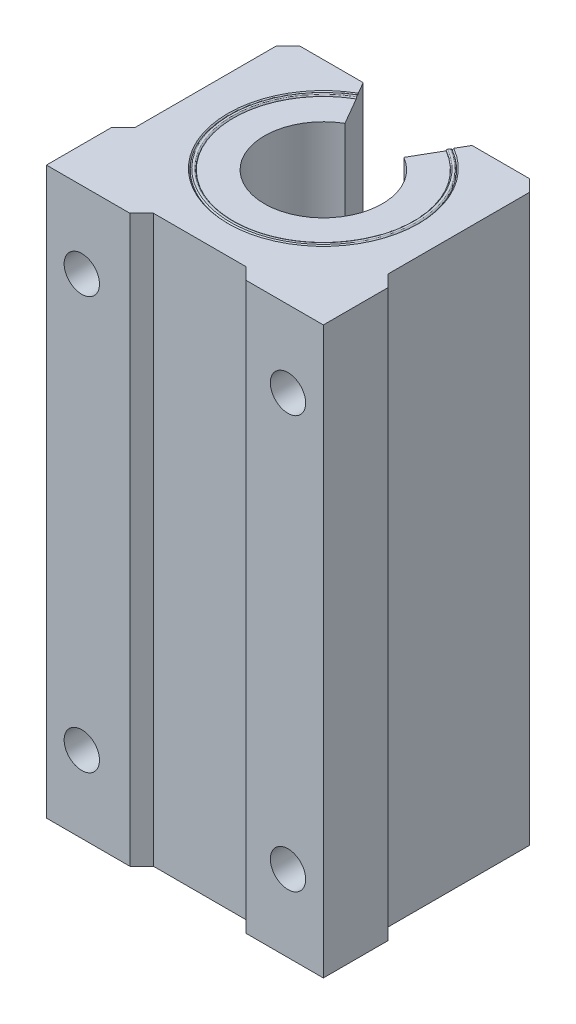
ISO-10303-21;
HEADER;
FILE_DESCRIPTION(('STEP AP214'),'2;1');
FILE_NAME('part.step','',(''),(''),'','','');
FILE_SCHEMA(('AUTOMOTIVE_DESIGN { 1 0 10303 214 1 1 1 1 }'));
ENDSEC;
DATA;
#1=APPLICATION_CONTEXT('core data for automotive mechanical design processes');
#2=APPLICATION_PROTOCOL_DEFINITION('international standard','automotive_design',2000,#1);
#3=PRODUCT_CONTEXT('',#1,'mechanical');
#4=PRODUCT('Part','Part','',(#3));
#5=PRODUCT_RELATED_PRODUCT_CATEGORY('part','',(#4));
#6=PRODUCT_DEFINITION_FORMATION('','',#4);
#7=PRODUCT_DEFINITION_CONTEXT('part definition',#1,'design');
#8=PRODUCT_DEFINITION('design','',#6,#7);
#9=PRODUCT_DEFINITION_SHAPE('','',#8);
#10=(LENGTH_UNIT() NAMED_UNIT(*) SI_UNIT(.MILLI.,.METRE.));
#11=(NAMED_UNIT(*) PLANE_ANGLE_UNIT() SI_UNIT($,.RADIAN.));
#12=(NAMED_UNIT(*) SI_UNIT($,.STERADIAN.) SOLID_ANGLE_UNIT());
#13=UNCERTAINTY_MEASURE_WITH_UNIT(LENGTH_MEASURE(1.E-05),#10,'distance_accuracy_value','');
#14=(GEOMETRIC_REPRESENTATION_CONTEXT(3) GLOBAL_UNCERTAINTY_ASSIGNED_CONTEXT((#13)) GLOBAL_UNIT_ASSIGNED_CONTEXT((#10,
#11,#12)) REPRESENTATION_CONTEXT('',''));
#15=CARTESIAN_POINT('',(0.,0.,0.));
#16=DIRECTION('',(0.,0.,1.));
#17=DIRECTION('',(1.,0.,0.));
#18=AXIS2_PLACEMENT_3D('',#15,#16,#17);
#19=CARTESIAN_POINT('',(0.,48.,0.));
#20=DIRECTION('',(0.,1.,0.));
#21=DIRECTION('',(0.,0.,1.));
#22=AXIS2_PLACEMENT_3D('',#19,#20,#21);
#23=PLANE('',#22);
#24=CARTESIAN_POINT('',(0.,48.,0.));
#25=DIRECTION('',(0.,1.,0.));
#26=DIRECTION('',(0.,0.,1.));
#27=AXIS2_PLACEMENT_3D('',#24,#25,#26);
#28=CIRCLE('',#27,15.45);
#29=CARTESIAN_POINT('',(-7.72500000000002,48.,-13.3800924884696));
#30=VERTEX_POINT('',#29);
#31=CARTESIAN_POINT('',(7.72499999999999,48.,-13.3800924884696));
#32=VERTEX_POINT('',#31);
#33=EDGE_CURVE('E221',#30,#32,#28,.T.);
#34=ORIENTED_EDGE('',*,*,#33,.F.);
#35=DIRECTION('',(-0.499999999999995,0.,-0.866025403784441));
#36=VECTOR('',#35,1.);
#37=CARTESIAN_POINT('',(-9.23760430703402,48.,-16.));
#38=LINE('',#37,#36);
#39=CARTESIAN_POINT('',(-7.89938053086696,48.,-13.6821284277819));
#40=VERTEX_POINT('',#39);
#41=EDGE_CURVE('E254',#30,#40,#38,.T.);
#42=ORIENTED_EDGE('',*,*,#41,.T.);
#43=CARTESIAN_POINT('',(0.,48.,0.));
#44=DIRECTION('',(0.,-1.,0.));
#45=DIRECTION('',(0.,0.,-1.));
#46=AXIS2_PLACEMENT_3D('',#43,#44,#45);
#47=CIRCLE('',#46,15.7987610617339);
#48=CARTESIAN_POINT('',(7.89938053086693,48.,-13.682128427782));
#49=VERTEX_POINT('',#48);
#50=EDGE_CURVE('E244',#40,#49,#47,.F.);
#51=ORIENTED_EDGE('',*,*,#50,.T.);
#52=DIRECTION('',(-0.500000000000007,0.,0.866025403784435));
#53=VECTOR('',#52,1.);
#54=CARTESIAN_POINT('',(9.23760430703402,48.,-16.));
#55=LINE('',#54,#53);
#56=EDGE_CURVE('E237',#49,#32,#55,.T.);
#57=ORIENTED_EDGE('',*,*,#56,.T.);
#58=EDGE_LOOP('',(#34,#42,#51,#57));
#59=FACE_BOUND('',#58,.T.);
#60=ADVANCED_FACE('F36',(#59),#23,.T.);
#61=CARTESIAN_POINT('',(0.,-48.,0.));
#62=DIRECTION('',(0.,1.,0.));
#63=DIRECTION('',(0.,0.,1.));
#64=AXIS2_PLACEMENT_3D('',#61,#62,#63);
#65=PLANE('',#64);
#66=CARTESIAN_POINT('',(0.,-48.,0.));
#67=DIRECTION('',(0.,1.,0.));
#68=DIRECTION('',(0.,0.,1.));
#69=AXIS2_PLACEMENT_3D('',#66,#67,#68);
#70=CIRCLE('',#69,15.45);
#71=CARTESIAN_POINT('',(-7.72500000000002,-48.,-13.3800924884696));
#72=VERTEX_POINT('',#71);
#73=CARTESIAN_POINT('',(7.72499999999999,-48.,-13.3800924884696));
#74=VERTEX_POINT('',#73);
#75=EDGE_CURVE('E399',#72,#74,#70,.T.);
#76=ORIENTED_EDGE('',*,*,#75,.T.);
#77=DIRECTION('',(-0.500000000000007,0.,0.866025403784435));
#78=VECTOR('',#77,1.);
#79=CARTESIAN_POINT('',(9.23760430703402,-48.,-16.));
#80=LINE('',#79,#78);
#81=CARTESIAN_POINT('',(7.89938053086693,-48.,-13.682128427782));
#82=VERTEX_POINT('',#81);
#83=EDGE_CURVE('E284',#82,#74,#80,.T.);
#84=ORIENTED_EDGE('',*,*,#83,.F.);
#85=CARTESIAN_POINT('',(0.,-48.,0.));
#86=DIRECTION('',(0.,1.,0.));
#87=DIRECTION('',(0.,0.,1.));
#88=AXIS2_PLACEMENT_3D('',#85,#86,#87);
#89=CIRCLE('',#88,15.7987610617339);
#90=CARTESIAN_POINT('',(-7.89938053086696,-48.,-13.6821284277819));
#91=VERTEX_POINT('',#90);
#92=EDGE_CURVE('E371',#82,#91,#89,.F.);
#93=ORIENTED_EDGE('',*,*,#92,.T.);
#94=DIRECTION('',(-0.499999999999995,0.,-0.866025403784441));
#95=VECTOR('',#94,1.);
#96=CARTESIAN_POINT('',(-9.23760430703402,-48.,-16.));
#97=LINE('',#96,#95);
#98=EDGE_CURVE('E289',#72,#91,#97,.T.);
#99=ORIENTED_EDGE('',*,*,#98,.F.);
#100=EDGE_LOOP('',(#76,#84,#93,#99));
#101=FACE_BOUND('',#100,.T.);
#102=ADVANCED_FACE('F540',(#101),#65,.F.);
#103=CARTESIAN_POINT('',(-7.83333333333334,48.,21.));
#104=DIRECTION('',(0.,0.,-1.));
#105=DIRECTION('',(-1.,0.,0.));
#106=AXIS2_PLACEMENT_3D('',#103,#104,#105);
#107=PLANE('',#106);
#108=DIRECTION('',(1.,0.,0.));
#109=VECTOR('',#108,1.);
#110=CARTESIAN_POINT('',(-7.83333333333334,-48.,21.));
#111=LINE('',#110,#109);
#112=CARTESIAN_POINT('',(-7.83333333333334,-48.,21.));
#113=VERTEX_POINT('',#112);
#114=CARTESIAN_POINT('',(7.83333333333333,-48.,21.));
#115=VERTEX_POINT('',#114);
#116=EDGE_CURVE('E269',#113,#115,#111,.T.);
#117=ORIENTED_EDGE('',*,*,#116,.T.);
#118=DIRECTION('',(0.,-1.,0.));
#119=VECTOR('',#118,1.);
#120=CARTESIAN_POINT('',(7.83333333333333,48.,21.));
#121=LINE('',#120,#119);
#122=CARTESIAN_POINT('',(7.83333333333333,48.,21.));
#123=VERTEX_POINT('',#122);
#124=EDGE_CURVE('E331',#123,#115,#121,.T.);
#125=ORIENTED_EDGE('',*,*,#124,.F.);
#126=DIRECTION('',(1.,0.,0.));
#127=VECTOR('',#126,1.);
#128=CARTESIAN_POINT('',(-7.83333333333334,48.,21.));
#129=LINE('',#128,#127);
#130=CARTESIAN_POINT('',(-7.83333333333334,48.,21.));
#131=VERTEX_POINT('',#130);
#132=EDGE_CURVE('E303',#131,#123,#129,.T.);
#133=ORIENTED_EDGE('',*,*,#132,.F.);
#134=DIRECTION('',(0.,-1.,0.));
#135=VECTOR('',#134,1.);
#136=CARTESIAN_POINT('',(-7.83333333333334,48.,21.));
#137=LINE('',#136,#135);
#138=EDGE_CURVE('E334',#131,#113,#137,.T.);
#139=ORIENTED_EDGE('',*,*,#138,.T.);
#140=EDGE_LOOP('',(#117,#125,#133,#139));
#141=FACE_BOUND('',#140,.T.);
#142=ADVANCED_FACE('F511',(#141),#107,.F.);
#143=CARTESIAN_POINT('',(7.83333333333333,48.,23.));
#144=DIRECTION('',(0.,0.,-1.));
#145=DIRECTION('',(-1.,0.,0.));
#146=AXIS2_PLACEMENT_3D('',#143,#144,#145);
#147=PLANE('',#146);
#148=CARTESIAN_POINT('',(17.,-35.,23.));
#149=DIRECTION('',(0.,0.,1.));
#150=DIRECTION('',(1.,0.,0.));
#151=AXIS2_PLACEMENT_3D('',#148,#149,#150);
#152=CIRCLE('',#151,2.99999999999999);
#153=CARTESIAN_POINT('',(20.,-35.,23.));
#154=VERTEX_POINT('',#153);
#155=EDGE_CURVE('E421',#154,#154,#152,.T.);
#156=ORIENTED_EDGE('',*,*,#155,.F.);
#157=EDGE_LOOP('',(#156));
#158=FACE_BOUND('',#157,.T.);
#159=CARTESIAN_POINT('',(17.,35.,23.));
#160=DIRECTION('',(0.,0.,1.));
#161=DIRECTION('',(1.,0.,0.));
#162=AXIS2_PLACEMENT_3D('',#159,#160,#161);
#163=CIRCLE('',#162,3.);
#164=CARTESIAN_POINT('',(20.,35.,23.));
#165=VERTEX_POINT('',#164);
#166=EDGE_CURVE('E433',#165,#165,#163,.T.);
#167=ORIENTED_EDGE('',*,*,#166,.F.);
#168=EDGE_LOOP('',(#167));
#169=FACE_BOUND('',#168,.T.);
#170=DIRECTION('',(1.,0.,0.));
#171=VECTOR('',#170,1.);
#172=CARTESIAN_POINT('',(7.83333333333333,48.,23.));
#173=LINE('',#172,#171);
#174=CARTESIAN_POINT('',(9.83333333333335,48.,23.));
#175=VERTEX_POINT('',#174);
#176=CARTESIAN_POINT('',(23.,48.,23.));
#177=VERTEX_POINT('',#176);
#178=EDGE_CURVE('E444',#175,#177,#173,.T.);
#179=ORIENTED_EDGE('',*,*,#178,.F.);
#180=DIRECTION('',(0.,-1.,0.));
#181=VECTOR('',#180,1.);
#182=CARTESIAN_POINT('',(9.83333333333335,48.,23.));
#183=LINE('',#182,#181);
#184=CARTESIAN_POINT('',(9.83333333333335,-48.,23.));
#185=VERTEX_POINT('',#184);
#186=EDGE_CURVE('E347',#175,#185,#183,.T.);
#187=ORIENTED_EDGE('',*,*,#186,.T.);
#188=DIRECTION('',(1.,0.,0.));
#189=VECTOR('',#188,1.);
#190=CARTESIAN_POINT('',(7.83333333333333,-48.,23.));
#191=LINE('',#190,#189);
#192=CARTESIAN_POINT('',(23.,-48.,23.));
#193=VERTEX_POINT('',#192);
#194=EDGE_CURVE('E272',#185,#193,#191,.T.);
#195=ORIENTED_EDGE('',*,*,#194,.T.);
#196=DIRECTION('',(0.,-1.,0.));
#197=VECTOR('',#196,1.);
#198=CARTESIAN_POINT('',(23.,48.,23.));
#199=LINE('',#198,#197);
#200=EDGE_CURVE('E328',#177,#193,#199,.T.);
#201=ORIENTED_EDGE('',*,*,#200,.F.);
#202=EDGE_LOOP('',(#179,#187,#195,#201));
#203=FACE_BOUND('',#202,.T.);
#204=ADVANCED_FACE('F519',(#158,#169,#203),#147,.F.);
#205=CARTESIAN_POINT('',(23.,48.,23.));
#206=DIRECTION('',(-1.,0.,0.));
#207=DIRECTION('',(0.,0.,1.));
#208=AXIS2_PLACEMENT_3D('',#205,#206,#207);
#209=PLANE('',#208);
#210=DIRECTION('',(0.,0.,-1.));
#211=VECTOR('',#210,1.);
#212=CARTESIAN_POINT('',(23.,-48.,23.));
#213=LINE('',#212,#211);
#214=CARTESIAN_POINT('',(23.,-48.,12.));
#215=VERTEX_POINT('',#214);
#216=EDGE_CURVE('E275',#193,#215,#213,.T.);
#217=ORIENTED_EDGE('',*,*,#216,.T.);
#218=DIRECTION('',(0.,-1.,0.));
#219=VECTOR('',#218,1.);
#220=CARTESIAN_POINT('',(23.,48.,12.));
#221=LINE('',#220,#219);
#222=CARTESIAN_POINT('',(23.,48.,12.));
#223=VERTEX_POINT('',#222);
#224=EDGE_CURVE('E325',#223,#215,#221,.T.);
#225=ORIENTED_EDGE('',*,*,#224,.F.);
#226=DIRECTION('',(0.,0.,-1.));
#227=VECTOR('',#226,1.);
#228=CARTESIAN_POINT('',(23.,48.,23.));
#229=LINE('',#228,#227);
#230=EDGE_CURVE('E446',#177,#223,#229,.T.);
#231=ORIENTED_EDGE('',*,*,#230,.F.);
#232=ORIENTED_EDGE('',*,*,#200,.T.);
#233=EDGE_LOOP('',(#217,#225,#231,#232));
#234=FACE_BOUND('',#233,.T.);
#235=ADVANCED_FACE('F526',(#234),#209,.F.);
#236=CARTESIAN_POINT('',(23.,48.,12.));
#237=DIRECTION('',(-0.707106781186543,0.,0.707106781186552));
#238=DIRECTION('',(0.707106781186552,0.,0.707106781186543));
#239=AXIS2_PLACEMENT_3D('',#236,#237,#238);
#240=PLANE('',#239);
#241=DIRECTION('',(-0.707106781186552,0.,-0.707106781186543));
#242=VECTOR('',#241,1.);
#243=CARTESIAN_POINT('',(23.,-48.,12.));
#244=LINE('',#243,#242);
#245=CARTESIAN_POINT('',(21.,-48.,10.));
#246=VERTEX_POINT('',#245);
#247=EDGE_CURVE('E277',#215,#246,#244,.T.);
#248=ORIENTED_EDGE('',*,*,#247,.T.);
#249=DIRECTION('',(0.,-1.,0.));
#250=VECTOR('',#249,1.);
#251=CARTESIAN_POINT('',(21.,48.,10.));
#252=LINE('',#251,#250);
#253=CARTESIAN_POINT('',(21.,48.,10.));
#254=VERTEX_POINT('',#253);
#255=EDGE_CURVE('E322',#254,#246,#252,.T.);
#256=ORIENTED_EDGE('',*,*,#255,.F.);
#257=DIRECTION('',(-0.707106781186552,0.,-0.707106781186543));
#258=VECTOR('',#257,1.);
#259=CARTESIAN_POINT('',(23.,48.,12.));
#260=LINE('',#259,#258);
#261=EDGE_CURVE('E448',#223,#254,#260,.T.);
#262=ORIENTED_EDGE('',*,*,#261,.F.);
#263=ORIENTED_EDGE('',*,*,#224,.T.);
#264=EDGE_LOOP('',(#248,#256,#262,#263));
#265=FACE_BOUND('',#264,.T.);
#266=ADVANCED_FACE('F529',(#265),#240,.F.);
#267=CARTESIAN_POINT('',(21.,48.,10.));
#268=DIRECTION('',(-1.,0.,0.));
#269=DIRECTION('',(0.,0.,1.));
#270=AXIS2_PLACEMENT_3D('',#267,#268,#269);
#271=PLANE('',#270);
#272=DIRECTION('',(0.,0.,-1.));
#273=VECTOR('',#272,1.);
#274=CARTESIAN_POINT('',(21.,-48.,10.));
#275=LINE('',#274,#273);
#276=CARTESIAN_POINT('',(21.,-48.,-14.));
#277=VERTEX_POINT('',#276);
#278=EDGE_CURVE('E279',#246,#277,#275,.T.);
#279=ORIENTED_EDGE('',*,*,#278,.T.);
#280=DIRECTION('',(0.,1.,0.));
#281=VECTOR('',#280,1.);
#282=CARTESIAN_POINT('',(21.,48.,-14.));
#283=LINE('',#282,#281);
#284=CARTESIAN_POINT('',(21.,48.,-14.));
#285=VERTEX_POINT('',#284);
#286=EDGE_CURVE('E366',#277,#285,#283,.T.);
#287=ORIENTED_EDGE('',*,*,#286,.T.);
#288=DIRECTION('',(0.,0.,-1.));
#289=VECTOR('',#288,1.);
#290=CARTESIAN_POINT('',(21.,48.,10.));
#291=LINE('',#290,#289);
#292=EDGE_CURVE('E250',#254,#285,#291,.T.);
#293=ORIENTED_EDGE('',*,*,#292,.F.);
#294=ORIENTED_EDGE('',*,*,#255,.T.);
#295=EDGE_LOOP('',(#279,#287,#293,#294));
#296=FACE_BOUND('',#295,.T.);
#297=ADVANCED_FACE('F530',(#296),#271,.F.);
#298=CARTESIAN_POINT('',(21.,48.,-16.));
#299=DIRECTION('',(0.,0.,1.));
#300=DIRECTION('',(1.,0.,0.));
#301=AXIS2_PLACEMENT_3D('',#298,#299,#300);
#302=PLANE('',#301);
#303=DIRECTION('',(-1.,0.,0.));
#304=VECTOR('',#303,1.);
#305=CARTESIAN_POINT('',(21.,48.,-16.));
#306=LINE('',#305,#304);
#307=CARTESIAN_POINT('',(19.,48.,-16.));
#308=VERTEX_POINT('',#307);
#309=CARTESIAN_POINT('',(9.23760430703402,48.,-16.));
#310=VERTEX_POINT('',#309);
#311=EDGE_CURVE('E246',#308,#310,#306,.T.);
#312=ORIENTED_EDGE('',*,*,#311,.F.);
#313=DIRECTION('',(0.,-1.,0.));
#314=VECTOR('',#313,1.);
#315=CARTESIAN_POINT('',(19.,48.,-16.));
#316=LINE('',#315,#314);
#317=CARTESIAN_POINT('',(19.,-48.,-16.));
#318=VERTEX_POINT('',#317);
#319=EDGE_CURVE('E363',#308,#318,#316,.T.);
#320=ORIENTED_EDGE('',*,*,#319,.T.);
#321=DIRECTION('',(-1.,0.,0.));
#322=VECTOR('',#321,1.);
#323=CARTESIAN_POINT('',(21.,-48.,-16.));
#324=LINE('',#323,#322);
#325=CARTESIAN_POINT('',(9.23760430703402,-48.,-16.));
#326=VERTEX_POINT('',#325);
#327=EDGE_CURVE('E282',#318,#326,#324,.T.);
#328=ORIENTED_EDGE('',*,*,#327,.T.);
#329=DIRECTION('',(0.,-1.,0.));
#330=VECTOR('',#329,1.);
#331=CARTESIAN_POINT('',(9.23760430703402,48.,-16.));
#332=LINE('',#331,#330);
#333=EDGE_CURVE('E319',#310,#326,#332,.T.);
#334=ORIENTED_EDGE('',*,*,#333,.F.);
#335=EDGE_LOOP('',(#312,#320,#328,#334));
#336=FACE_BOUND('',#335,.T.);
#337=ADVANCED_FACE('F463',(#336),#302,.F.);
#338=CARTESIAN_POINT('',(9.23760430703402,48.,-16.));
#339=DIRECTION('',(0.866025403784434,0.,0.500000000000007));
#340=DIRECTION('',(0.500000000000007,0.,-0.866025403784435));
#341=AXIS2_PLACEMENT_3D('',#338,#339,#340);
#342=PLANE('',#341);
#343=DIRECTION('',(0.500000000000007,0.,-0.866025403784435));
#344=VECTOR('',#343,1.);
#345=CARTESIAN_POINT('',(9.23760430703402,47.8,-16.));
#346=LINE('',#345,#344);
#347=CARTESIAN_POINT('',(4.99999999999995,47.8,-8.66025403784442));
#348=VERTEX_POINT('',#347);
#349=CARTESIAN_POINT('',(7.62499999999998,47.8,-13.2068874077127));
#350=VERTEX_POINT('',#349);
#351=EDGE_CURVE('E239',#348,#350,#346,.T.);
#352=ORIENTED_EDGE('',*,*,#351,.T.);
#353=CARTESIAN_POINT('',(7.72500000000011,47.8,-13.3800924884695));
#354=DIRECTION('',(0.866025403784434,0.,0.500000000000007));
#355=DIRECTION('',(0.500000000000007,0.,-0.866025403784435));
#356=AXIS2_PLACEMENT_3D('',#353,#354,#355);
#357=CIRCLE('',#356,0.199999999999993);
#358=EDGE_CURVE('E225',#350,#32,#357,.F.);
#359=ORIENTED_EDGE('',*,*,#358,.T.);
#360=ORIENTED_EDGE('',*,*,#56,.F.);
#361=CARTESIAN_POINT('',(7.89938053086706,47.7987572243138,-13.6821284277819));
#362=DIRECTION('',(0.866025403784434,0.,0.500000000000007));
#363=DIRECTION('',(0.500000000000007,0.,-0.866025403784435));
#364=AXIS2_PLACEMENT_3D('',#361,#362,#363);
#365=CIRCLE('',#364,0.201242775686203);
#366=CARTESIAN_POINT('',(7.99999999999999,47.8,-13.856406460551));
#367=VERTEX_POINT('',#366);
#368=EDGE_CURVE('E874',#49,#367,#365,.F.);
#369=ORIENTED_EDGE('',*,*,#368,.T.);
#370=DIRECTION('',(0.353553390593279,0.707106781186548,-0.612372435695792));
#371=VECTOR('',#370,1.);
#372=CARTESIAN_POINT('',(-1.26194426293921E-13,31.8,0.));
#373=LINE('',#372,#371);
#374=CARTESIAN_POINT('',(8.1,48.,-14.0296115413079));
#375=VERTEX_POINT('',#374);
#376=EDGE_CURVE('E472',#367,#375,#373,.T.);
#377=ORIENTED_EDGE('',*,*,#376,.T.);
#378=EDGE_CURVE('E245',#310,#375,#55,.T.);
#379=ORIENTED_EDGE('',*,*,#378,.F.);
#380=ORIENTED_EDGE('',*,*,#333,.T.);
#381=CARTESIAN_POINT('',(8.1,-48.,-14.0296115413079));
#382=VERTEX_POINT('',#381);
#383=EDGE_CURVE('E285',#326,#382,#80,.T.);
#384=ORIENTED_EDGE('',*,*,#383,.T.);
#385=DIRECTION('',(-0.353553390593279,0.707106781186548,0.612372435695792));
#386=VECTOR('',#385,1.);
#387=CARTESIAN_POINT('',(-1.26194426293921E-13,-31.8,0.));
#388=LINE('',#387,#386);
#389=CARTESIAN_POINT('',(7.99999999999999,-47.8,-13.856406460551));
#390=VERTEX_POINT('',#389);
#391=EDGE_CURVE('E411',#382,#390,#388,.T.);
#392=ORIENTED_EDGE('',*,*,#391,.T.);
#393=CARTESIAN_POINT('',(7.89938053086706,-47.7987572243138,-13.6821284277819));
#394=DIRECTION('',(0.866025403784434,0.,0.500000000000007));
#395=DIRECTION('',(0.500000000000007,0.,-0.866025403784435));
#396=AXIS2_PLACEMENT_3D('',#393,#394,#395);
#397=CIRCLE('',#396,0.201242775686203);
#398=EDGE_CURVE('E417',#390,#82,#397,.F.);
#399=ORIENTED_EDGE('',*,*,#398,.T.);
#400=ORIENTED_EDGE('',*,*,#83,.T.);
#401=CARTESIAN_POINT('',(7.72500000000011,-47.8,-13.3800924884695));
#402=DIRECTION('',(0.866025403784434,0.,0.500000000000007));
#403=DIRECTION('',(0.500000000000007,0.,-0.866025403784435));
#404=AXIS2_PLACEMENT_3D('',#401,#402,#403);
#405=CIRCLE('',#404,0.199999999999993);
#406=CARTESIAN_POINT('',(7.62499999999998,-47.8,-13.2068874077127));
#407=VERTEX_POINT('',#406);
#408=EDGE_CURVE('E396',#74,#407,#405,.F.);
#409=ORIENTED_EDGE('',*,*,#408,.T.);
#410=DIRECTION('',(-0.500000000000007,0.,0.866025403784435));
#411=VECTOR('',#410,1.);
#412=CARTESIAN_POINT('',(9.23760430703402,-47.8,-16.));
#413=LINE('',#412,#411);
#414=CARTESIAN_POINT('',(4.99999999999995,-47.8,-8.66025403784442));
#415=VERTEX_POINT('',#414);
#416=EDGE_CURVE('E393',#407,#415,#413,.T.);
#417=ORIENTED_EDGE('',*,*,#416,.T.);
#418=DIRECTION('',(0.,-1.,0.));
#419=VECTOR('',#418,1.);
#420=CARTESIAN_POINT('',(4.99999999999995,48.,-8.66025403784442));
#421=LINE('',#420,#419);
#422=EDGE_CURVE('E317',#348,#415,#421,.T.);
#423=ORIENTED_EDGE('',*,*,#422,.F.);
#424=EDGE_LOOP('',(#352,#359,#360,#369,#377,#379,#380,#384,#392,#399,#400,#409,#417,#423));
#425=FACE_BOUND('',#424,.T.);
#426=ADVANCED_FACE('F235',(#425),#342,.F.);
#427=CARTESIAN_POINT('',(0.,48.,0.));
#428=DIRECTION('',(0.,-1.,0.));
#429=DIRECTION('',(0.,0.,-1.));
#430=AXIS2_PLACEMENT_3D('',#427,#428,#429);
#431=CYLINDRICAL_SURFACE('',#430,10.);
#432=DIRECTION('',(0.,-1.,0.));
#433=VECTOR('',#432,1.);
#434=CARTESIAN_POINT('',(-5.00000000000005,48.,-8.66025403784436));
#435=LINE('',#434,#433);
#436=CARTESIAN_POINT('',(-5.00000000000005,47.8,-8.66025403784436));
#437=VERTEX_POINT('',#436);
#438=CARTESIAN_POINT('',(-5.00000000000005,-47.8,-8.66025403784436));
#439=VERTEX_POINT('',#438);
#440=EDGE_CURVE('E315',#437,#439,#435,.T.);
#441=ORIENTED_EDGE('',*,*,#440,.F.);
#442=CARTESIAN_POINT('',(0.,47.8,0.));
#443=DIRECTION('',(0.,-1.,0.));
#444=DIRECTION('',(0.,0.,-1.));
#445=AXIS2_PLACEMENT_3D('',#442,#443,#444);
#446=CIRCLE('',#445,10.);
#447=EDGE_CURVE('E51',#437,#348,#446,.F.);
#448=ORIENTED_EDGE('',*,*,#447,.T.);
#449=ORIENTED_EDGE('',*,*,#422,.T.);
#450=CARTESIAN_POINT('',(0.,-47.8,0.));
#451=DIRECTION('',(0.,1.,0.));
#452=DIRECTION('',(0.,0.,1.));
#453=AXIS2_PLACEMENT_3D('',#450,#451,#452);
#454=CIRCLE('',#453,10.);
#455=EDGE_CURVE('E390',#415,#439,#454,.F.);
#456=ORIENTED_EDGE('',*,*,#455,.T.);
#457=EDGE_LOOP('',(#441,#448,#449,#456));
#458=FACE_BOUND('',#457,.T.);
#459=ADVANCED_FACE('F388',(#458),#431,.F.);
#460=CARTESIAN_POINT('',(-9.23760430703402,48.,-16.));
#461=DIRECTION('',(-0.866025403784442,0.,0.499999999999995));
#462=DIRECTION('',(0.499999999999995,0.,0.866025403784442));
#463=AXIS2_PLACEMENT_3D('',#460,#461,#462);
#464=PLANE('',#463);
#465=ORIENTED_EDGE('',*,*,#41,.F.);
#466=CARTESIAN_POINT('',(-7.72499999999992,47.8,-13.3800924884696));
#467=DIRECTION('',(-0.866025403784442,0.,0.499999999999995));
#468=DIRECTION('',(0.499999999999995,0.,0.866025403784442));
#469=AXIS2_PLACEMENT_3D('',#466,#467,#468);
#470=CIRCLE('',#469,0.199999999999993);
#471=CARTESIAN_POINT('',(-7.62500000000002,47.8,-13.2068874077127));
#472=VERTEX_POINT('',#471);
#473=EDGE_CURVE('E11',#30,#472,#470,.F.);
#474=ORIENTED_EDGE('',*,*,#473,.T.);
#475=DIRECTION('',(0.499999999999995,0.,0.866025403784442));
#476=VECTOR('',#475,1.);
#477=CARTESIAN_POINT('',(-9.23760430703402,47.8,-16.));
#478=LINE('',#477,#476);
#479=EDGE_CURVE('E44',#472,#437,#478,.T.);
#480=ORIENTED_EDGE('',*,*,#479,.T.);
#481=ORIENTED_EDGE('',*,*,#440,.T.);
#482=DIRECTION('',(-0.499999999999995,0.,-0.866025403784442));
#483=VECTOR('',#482,1.);
#484=CARTESIAN_POINT('',(-9.23760430703402,-47.8,-16.));
#485=LINE('',#484,#483);
#486=CARTESIAN_POINT('',(-7.62500000000002,-47.8,-13.2068874077127));
#487=VERTEX_POINT('',#486);
#488=EDGE_CURVE('E374',#439,#487,#485,.T.);
#489=ORIENTED_EDGE('',*,*,#488,.T.);
#490=CARTESIAN_POINT('',(-7.72499999999992,-47.8,-13.3800924884696));
#491=DIRECTION('',(-0.866025403784442,0.,0.499999999999995));
#492=DIRECTION('',(0.499999999999995,0.,0.866025403784442));
#493=AXIS2_PLACEMENT_3D('',#490,#491,#492);
#494=CIRCLE('',#493,0.199999999999993);
#495=EDGE_CURVE('E377',#487,#72,#494,.F.);
#496=ORIENTED_EDGE('',*,*,#495,.T.);
#497=ORIENTED_EDGE('',*,*,#98,.T.);
#498=CARTESIAN_POINT('',(-7.89938053086686,-47.7987572243138,-13.682128427782));
#499=DIRECTION('',(-0.866025403784442,0.,0.499999999999995));
#500=DIRECTION('',(0.499999999999995,0.,0.866025403784442));
#501=AXIS2_PLACEMENT_3D('',#498,#499,#500);
#502=CIRCLE('',#501,0.201242775686203);
#503=CARTESIAN_POINT('',(-8.00000000000003,-47.8,-13.856406460551));
#504=VERTEX_POINT('',#503);
#505=EDGE_CURVE('E414',#91,#504,#502,.F.);
#506=ORIENTED_EDGE('',*,*,#505,.T.);
#507=DIRECTION('',(-0.35355339059327,-0.707106781186548,-0.612372435695797));
#508=VECTOR('',#507,1.);
#509=CARTESIAN_POINT('',(-1.03659707312864E-13,-31.8,0.));
#510=LINE('',#509,#508);
#511=CARTESIAN_POINT('',(-8.10000000000003,-48.,-14.0296115413079));
#512=VERTEX_POINT('',#511);
#513=EDGE_CURVE('E408',#504,#512,#510,.T.);
#514=ORIENTED_EDGE('',*,*,#513,.T.);
#515=CARTESIAN_POINT('',(-9.23760430703402,-48.,-16.));
#516=VERTEX_POINT('',#515);
#517=EDGE_CURVE('E288',#512,#516,#97,.T.);
#518=ORIENTED_EDGE('',*,*,#517,.T.);
#519=DIRECTION('',(0.,-1.,0.));
#520=VECTOR('',#519,1.);
#521=CARTESIAN_POINT('',(-9.23760430703402,48.,-16.));
#522=LINE('',#521,#520);
#523=CARTESIAN_POINT('',(-9.23760430703402,48.,-16.));
#524=VERTEX_POINT('',#523);
#525=EDGE_CURVE('E312',#524,#516,#522,.T.);
#526=ORIENTED_EDGE('',*,*,#525,.F.);
#527=CARTESIAN_POINT('',(-8.10000000000003,48.,-14.0296115413079));
#528=VERTEX_POINT('',#527);
#529=EDGE_CURVE('E249',#528,#524,#38,.T.);
#530=ORIENTED_EDGE('',*,*,#529,.F.);
#531=DIRECTION('',(0.35355339059327,-0.707106781186548,0.612372435695797));
#532=VECTOR('',#531,1.);
#533=CARTESIAN_POINT('',(-1.03659707312864E-13,31.8,0.));
#534=LINE('',#533,#532);
#535=CARTESIAN_POINT('',(-8.00000000000003,47.8,-13.856406460551));
#536=VERTEX_POINT('',#535);
#537=EDGE_CURVE('E59',#528,#536,#534,.T.);
#538=ORIENTED_EDGE('',*,*,#537,.T.);
#539=CARTESIAN_POINT('',(-7.89938053086686,47.7987572243138,-13.682128427782));
#540=DIRECTION('',(-0.866025403784442,0.,0.499999999999995));
#541=DIRECTION('',(0.499999999999995,0.,0.866025403784442));
#542=AXIS2_PLACEMENT_3D('',#539,#540,#541);
#543=CIRCLE('',#542,0.201242775686203);
#544=EDGE_CURVE('E872',#536,#40,#543,.F.);
#545=ORIENTED_EDGE('',*,*,#544,.T.);
#546=EDGE_LOOP('',(#465,#474,#480,#481,#489,#496,#497,#506,#514,#518,#526,#530,#538,#545));
#547=FACE_BOUND('',#546,.T.);
#548=ADVANCED_FACE('F384',(#547),#464,.F.);
#549=CARTESIAN_POINT('',(-9.23760430703402,48.,-16.));
#550=DIRECTION('',(0.,0.,1.));
#551=DIRECTION('',(1.,0.,0.));
#552=AXIS2_PLACEMENT_3D('',#549,#550,#551);
#553=PLANE('',#552);
#554=DIRECTION('',(-1.,0.,0.));
#555=VECTOR('',#554,1.);
#556=CARTESIAN_POINT('',(-9.23760430703402,-48.,-16.));
#557=LINE('',#556,#555);
#558=CARTESIAN_POINT('',(-20.,-48.,-16.));
#559=VERTEX_POINT('',#558);
#560=EDGE_CURVE('E291',#516,#559,#557,.T.);
#561=ORIENTED_EDGE('',*,*,#560,.T.);
#562=DIRECTION('',(0.,1.,0.));
#563=VECTOR('',#562,1.);
#564=CARTESIAN_POINT('',(-20.,48.,-16.));
#565=LINE('',#564,#563);
#566=CARTESIAN_POINT('',(-20.,48.,-16.));
#567=VERTEX_POINT('',#566);
#568=EDGE_CURVE('E357',#559,#567,#565,.T.);
#569=ORIENTED_EDGE('',*,*,#568,.T.);
#570=DIRECTION('',(-1.,0.,0.));
#571=VECTOR('',#570,1.);
#572=CARTESIAN_POINT('',(-9.23760430703402,48.,-16.));
#573=LINE('',#572,#571);
#574=EDGE_CURVE('E256',#524,#567,#573,.T.);
#575=ORIENTED_EDGE('',*,*,#574,.F.);
#576=ORIENTED_EDGE('',*,*,#525,.T.);
#577=EDGE_LOOP('',(#561,#569,#575,#576));
#578=FACE_BOUND('',#577,.T.);
#579=ADVANCED_FACE('F479',(#578),#553,.F.);
#580=CARTESIAN_POINT('',(-22.,48.,-16.));
#581=DIRECTION('',(1.,0.,0.));
#582=DIRECTION('',(0.,0.,-1.));
#583=AXIS2_PLACEMENT_3D('',#580,#581,#582);
#584=PLANE('',#583);
#585=DIRECTION('',(0.,0.,1.));
#586=VECTOR('',#585,1.);
#587=CARTESIAN_POINT('',(-22.,48.,-16.));
#588=LINE('',#587,#586);
#589=CARTESIAN_POINT('',(-22.,48.,-14.));
#590=VERTEX_POINT('',#589);
#591=CARTESIAN_POINT('',(-22.,48.,9.99999999999999));
#592=VERTEX_POINT('',#591);
#593=EDGE_CURVE('E259',#590,#592,#588,.T.);
#594=ORIENTED_EDGE('',*,*,#593,.F.);
#595=DIRECTION('',(0.,-1.,0.));
#596=VECTOR('',#595,1.);
#597=CARTESIAN_POINT('',(-22.,48.,-14.));
#598=LINE('',#597,#596);
#599=CARTESIAN_POINT('',(-22.,-48.,-14.));
#600=VERTEX_POINT('',#599);
#601=EDGE_CURVE('E350',#590,#600,#598,.T.);
#602=ORIENTED_EDGE('',*,*,#601,.T.);
#603=DIRECTION('',(0.,0.,1.));
#604=VECTOR('',#603,1.);
#605=CARTESIAN_POINT('',(-22.,-48.,-16.));
#606=LINE('',#605,#604);
#607=CARTESIAN_POINT('',(-22.,-48.,9.99999999999999));
#608=VERTEX_POINT('',#607);
#609=EDGE_CURVE('E294',#600,#608,#606,.T.);
#610=ORIENTED_EDGE('',*,*,#609,.T.);
#611=DIRECTION('',(0.,-1.,0.));
#612=VECTOR('',#611,1.);
#613=CARTESIAN_POINT('',(-22.,48.,9.99999999999999));
#614=LINE('',#613,#612);
#615=EDGE_CURVE('E309',#592,#608,#614,.T.);
#616=ORIENTED_EDGE('',*,*,#615,.F.);
#617=EDGE_LOOP('',(#594,#602,#610,#616));
#618=FACE_BOUND('',#617,.T.);
#619=ADVANCED_FACE('F488',(#618),#584,.F.);
#620=CARTESIAN_POINT('',(-22.,48.,9.99999999999999));
#621=DIRECTION('',(0.707106781186549,0.,0.707106781186546));
#622=DIRECTION('',(0.707106781186546,0.,-0.707106781186549));
#623=AXIS2_PLACEMENT_3D('',#620,#621,#622);
#624=PLANE('',#623);
#625=DIRECTION('',(-0.707106781186546,0.,0.707106781186549));
#626=VECTOR('',#625,1.);
#627=CARTESIAN_POINT('',(-22.,-48.,9.99999999999999));
#628=LINE('',#627,#626);
#629=CARTESIAN_POINT('',(-24.,-48.,12.));
#630=VERTEX_POINT('',#629);
#631=EDGE_CURVE('E296',#608,#630,#628,.T.);
#632=ORIENTED_EDGE('',*,*,#631,.T.);
#633=DIRECTION('',(0.,-1.,0.));
#634=VECTOR('',#633,1.);
#635=CARTESIAN_POINT('',(-24.,48.,12.));
#636=LINE('',#635,#634);
#637=CARTESIAN_POINT('',(-24.,48.,12.));
#638=VERTEX_POINT('',#637);
#639=EDGE_CURVE('E306',#638,#630,#636,.T.);
#640=ORIENTED_EDGE('',*,*,#639,.F.);
#641=DIRECTION('',(-0.707106781186546,0.,0.707106781186549));
#642=VECTOR('',#641,1.);
#643=CARTESIAN_POINT('',(-22.,48.,9.99999999999999));
#644=LINE('',#643,#642);
#645=EDGE_CURVE('E261',#592,#638,#644,.T.);
#646=ORIENTED_EDGE('',*,*,#645,.F.);
#647=ORIENTED_EDGE('',*,*,#615,.T.);
#648=EDGE_LOOP('',(#632,#640,#646,#647));
#649=FACE_BOUND('',#648,.T.);
#650=ADVANCED_FACE('F495',(#649),#624,.F.);
#651=CARTESIAN_POINT('',(-24.,48.,12.));
#652=DIRECTION('',(1.,0.,0.));
#653=DIRECTION('',(0.,0.,-1.));
#654=AXIS2_PLACEMENT_3D('',#651,#652,#653);
#655=PLANE('',#654);
#656=DIRECTION('',(0.,0.,1.));
#657=VECTOR('',#656,1.);
#658=CARTESIAN_POINT('',(-24.,-48.,12.));
#659=LINE('',#658,#657);
#660=CARTESIAN_POINT('',(-24.,-48.,23.));
#661=VERTEX_POINT('',#660);
#662=EDGE_CURVE('E298',#630,#661,#659,.T.);
#663=ORIENTED_EDGE('',*,*,#662,.T.);
#664=DIRECTION('',(0.,-1.,0.));
#665=VECTOR('',#664,1.);
#666=CARTESIAN_POINT('',(-24.,48.,23.));
#667=LINE('',#666,#665);
#668=CARTESIAN_POINT('',(-24.,48.,23.));
#669=VERTEX_POINT('',#668);
#670=EDGE_CURVE('E268',#669,#661,#667,.T.);
#671=ORIENTED_EDGE('',*,*,#670,.F.);
#672=DIRECTION('',(0.,0.,1.));
#673=VECTOR('',#672,1.);
#674=CARTESIAN_POINT('',(-24.,48.,12.));
#675=LINE('',#674,#673);
#676=EDGE_CURVE('E263',#638,#669,#675,.T.);
#677=ORIENTED_EDGE('',*,*,#676,.F.);
#678=ORIENTED_EDGE('',*,*,#639,.T.);
#679=EDGE_LOOP('',(#663,#671,#677,#678));
#680=FACE_BOUND('',#679,.T.);
#681=ADVANCED_FACE('F499',(#680),#655,.F.);
#682=CARTESIAN_POINT('',(-24.,48.,23.));
#683=DIRECTION('',(0.,0.,-1.));
#684=DIRECTION('',(-1.,0.,0.));
#685=AXIS2_PLACEMENT_3D('',#682,#683,#684);
#686=PLANE('',#685);
#687=CARTESIAN_POINT('',(-18.,-35.,23.));
#688=DIRECTION('',(0.,0.,1.));
#689=DIRECTION('',(1.,0.,0.));
#690=AXIS2_PLACEMENT_3D('',#687,#688,#689);
#691=CIRCLE('',#690,3.);
#692=CARTESIAN_POINT('',(-15.,-35.,23.));
#693=VERTEX_POINT('',#692);
#694=EDGE_CURVE('E427',#693,#693,#691,.T.);
#695=ORIENTED_EDGE('',*,*,#694,.F.);
#696=EDGE_LOOP('',(#695));
#697=FACE_BOUND('',#696,.T.);
#698=CARTESIAN_POINT('',(-18.,35.,23.));
#699=DIRECTION('',(0.,0.,1.));
#700=DIRECTION('',(1.,0.,0.));
#701=AXIS2_PLACEMENT_3D('',#698,#699,#700);
#702=CIRCLE('',#701,3.);
#703=CARTESIAN_POINT('',(-15.,35.,23.));
#704=VERTEX_POINT('',#703);
#705=EDGE_CURVE('E436',#704,#704,#702,.T.);
#706=ORIENTED_EDGE('',*,*,#705,.F.);
#707=EDGE_LOOP('',(#706));
#708=FACE_BOUND('',#707,.T.);
#709=DIRECTION('',(1.,0.,0.));
#710=VECTOR('',#709,1.);
#711=CARTESIAN_POINT('',(-24.,-48.,23.));
#712=LINE('',#711,#710);
#713=CARTESIAN_POINT('',(-9.83333333333334,-48.,23.));
#714=VERTEX_POINT('',#713);
#715=EDGE_CURVE('E300',#661,#714,#712,.T.);
#716=ORIENTED_EDGE('',*,*,#715,.T.);
#717=DIRECTION('',(0.,1.,0.));
#718=VECTOR('',#717,1.);
#719=CARTESIAN_POINT('',(-9.83333333333334,48.,23.));
#720=LINE('',#719,#718);
#721=CARTESIAN_POINT('',(-9.83333333333334,48.,23.));
#722=VERTEX_POINT('',#721);
#723=EDGE_CURVE('E341',#714,#722,#720,.T.);
#724=ORIENTED_EDGE('',*,*,#723,.T.);
#725=DIRECTION('',(1.,0.,0.));
#726=VECTOR('',#725,1.);
#727=CARTESIAN_POINT('',(-24.,48.,23.));
#728=LINE('',#727,#726);
#729=EDGE_CURVE('E265',#669,#722,#728,.T.);
#730=ORIENTED_EDGE('',*,*,#729,.F.);
#731=ORIENTED_EDGE('',*,*,#670,.T.);
#732=EDGE_LOOP('',(#716,#724,#730,#731));
#733=FACE_BOUND('',#732,.T.);
#734=ADVANCED_FACE('F549',(#697,#708,#733),#686,.F.);
#735=CARTESIAN_POINT('',(0.,48.,0.));
#736=DIRECTION('',(0.,1.,0.));
#737=DIRECTION('',(0.,0.,1.));
#738=AXIS2_PLACEMENT_3D('',#735,#736,#737);
#739=CIRCLE('',#738,16.2);
#740=EDGE_CURVE('E380',#528,#375,#739,.T.);
#741=ORIENTED_EDGE('',*,*,#740,.F.);
#742=ORIENTED_EDGE('',*,*,#529,.T.);
#743=ORIENTED_EDGE('',*,*,#574,.T.);
#744=DIRECTION('',(0.70710678118655,0.,-0.707106781186545));
#745=VECTOR('',#744,1.);
#746=CARTESIAN_POINT('',(-17.9999999999999,48.,-18.));
#747=LINE('',#746,#745);
#748=EDGE_CURVE('E361',#567,#590,#747,.F.);
#749=ORIENTED_EDGE('',*,*,#748,.T.);
#750=ORIENTED_EDGE('',*,*,#593,.T.);
#751=ORIENTED_EDGE('',*,*,#645,.T.);
#752=ORIENTED_EDGE('',*,*,#676,.T.);
#753=ORIENTED_EDGE('',*,*,#729,.T.);
#754=DIRECTION('',(-0.70710678118655,0.,0.707106781186545));
#755=VECTOR('',#754,1.);
#756=CARTESIAN_POINT('',(6.58333333333337,48.,6.58333333333341));
#757=LINE('',#756,#755);
#758=EDGE_CURVE('E345',#722,#131,#757,.F.);
#759=ORIENTED_EDGE('',*,*,#758,.T.);
#760=ORIENTED_EDGE('',*,*,#132,.T.);
#761=DIRECTION('',(-0.707106781186545,0.,-0.70710678118655));
#762=VECTOR('',#761,1.);
#763=CARTESIAN_POINT('',(-6.58333333333329,48.,6.58333333333325));
#764=LINE('',#763,#762);
#765=EDGE_CURVE('E343',#123,#175,#764,.F.);
#766=ORIENTED_EDGE('',*,*,#765,.T.);
#767=ORIENTED_EDGE('',*,*,#178,.T.);
#768=ORIENTED_EDGE('',*,*,#230,.T.);
#769=ORIENTED_EDGE('',*,*,#261,.T.);
#770=ORIENTED_EDGE('',*,*,#292,.T.);
#771=DIRECTION('',(0.707106781186545,0.,0.70710678118655));
#772=VECTOR('',#771,1.);
#773=CARTESIAN_POINT('',(17.5000000000001,48.,-17.5));
#774=LINE('',#773,#772);
#775=EDGE_CURVE('E359',#285,#308,#774,.F.);
#776=ORIENTED_EDGE('',*,*,#775,.T.);
#777=ORIENTED_EDGE('',*,*,#311,.T.);
#778=ORIENTED_EDGE('',*,*,#378,.T.);
#779=EDGE_LOOP('',(#741,#742,#743,#749,#750,#751,#752,#753,#759,#760,#766,#767,#768,#769,#770,
#776,#777,#778));
#780=FACE_BOUND('',#779,.T.);
#781=ADVANCED_FACE('F453',(#780),#23,.T.);
#782=ORIENTED_EDGE('',*,*,#517,.F.);
#783=CARTESIAN_POINT('',(0.,-48.,0.));
#784=DIRECTION('',(0.,1.,0.));
#785=DIRECTION('',(0.,0.,1.));
#786=AXIS2_PLACEMENT_3D('',#783,#784,#785);
#787=CIRCLE('',#786,16.2);
#788=EDGE_CURVE('E368',#512,#382,#787,.T.);
#789=ORIENTED_EDGE('',*,*,#788,.T.);
#790=ORIENTED_EDGE('',*,*,#383,.F.);
#791=ORIENTED_EDGE('',*,*,#327,.F.);
#792=DIRECTION('',(-0.707106781186545,0.,-0.70710678118655));
#793=VECTOR('',#792,1.);
#794=CARTESIAN_POINT('',(19.,-48.,-16.));
#795=LINE('',#794,#793);
#796=EDGE_CURVE('E353',#318,#277,#795,.F.);
#797=ORIENTED_EDGE('',*,*,#796,.T.);
#798=ORIENTED_EDGE('',*,*,#278,.F.);
#799=ORIENTED_EDGE('',*,*,#247,.F.);
#800=ORIENTED_EDGE('',*,*,#216,.F.);
#801=ORIENTED_EDGE('',*,*,#194,.F.);
#802=DIRECTION('',(0.707106781186545,0.,0.70710678118655));
#803=VECTOR('',#802,1.);
#804=CARTESIAN_POINT('',(9.83333333333335,-48.,23.));
#805=LINE('',#804,#803);
#806=EDGE_CURVE('E337',#185,#115,#805,.F.);
#807=ORIENTED_EDGE('',*,*,#806,.T.);
#808=ORIENTED_EDGE('',*,*,#116,.F.);
#809=DIRECTION('',(0.70710678118655,0.,-0.707106781186545));
#810=VECTOR('',#809,1.);
#811=CARTESIAN_POINT('',(-7.83333333333334,-48.,21.));
#812=LINE('',#811,#810);
#813=EDGE_CURVE('E339',#113,#714,#812,.F.);
#814=ORIENTED_EDGE('',*,*,#813,.T.);
#815=ORIENTED_EDGE('',*,*,#715,.F.);
#816=ORIENTED_EDGE('',*,*,#662,.F.);
#817=ORIENTED_EDGE('',*,*,#631,.F.);
#818=ORIENTED_EDGE('',*,*,#609,.F.);
#819=DIRECTION('',(-0.70710678118655,0.,0.707106781186545));
#820=VECTOR('',#819,1.);
#821=CARTESIAN_POINT('',(-22.,-48.,-14.));
#822=LINE('',#821,#820);
#823=EDGE_CURVE('E355',#600,#559,#822,.F.);
#824=ORIENTED_EDGE('',*,*,#823,.T.);
#825=ORIENTED_EDGE('',*,*,#560,.F.);
#826=EDGE_LOOP('',(#782,#789,#790,#791,#797,#798,#799,#800,#801,#807,#808,#814,#815,#816,#817,
#818,#824,#825));
#827=FACE_BOUND('',#826,.T.);
#828=ADVANCED_FACE('F468',(#827),#65,.F.);
#829=CARTESIAN_POINT('',(-7.83333333333334,48.,21.));
#830=DIRECTION('',(-0.707106781186545,0.,-0.70710678118655));
#831=DIRECTION('',(-0.70710678118655,0.,0.707106781186545));
#832=AXIS2_PLACEMENT_3D('',#829,#830,#831);
#833=PLANE('',#832);
#834=ORIENTED_EDGE('',*,*,#758,.F.);
#835=ORIENTED_EDGE('',*,*,#723,.F.);
#836=ORIENTED_EDGE('',*,*,#813,.F.);
#837=ORIENTED_EDGE('',*,*,#138,.F.);
#838=EDGE_LOOP('',(#834,#835,#836,#837));
#839=FACE_BOUND('',#838,.T.);
#840=ADVANCED_FACE('F508',(#839),#833,.F.);
#841=CARTESIAN_POINT('',(9.83333333333335,48.,23.));
#842=DIRECTION('',(0.70710678118655,0.,-0.707106781186545));
#843=DIRECTION('',(-0.707106781186545,0.,-0.70710678118655));
#844=AXIS2_PLACEMENT_3D('',#841,#842,#843);
#845=PLANE('',#844);
#846=ORIENTED_EDGE('',*,*,#765,.F.);
#847=ORIENTED_EDGE('',*,*,#124,.T.);
#848=ORIENTED_EDGE('',*,*,#806,.F.);
#849=ORIENTED_EDGE('',*,*,#186,.F.);
#850=EDGE_LOOP('',(#846,#847,#848,#849));
#851=FACE_BOUND('',#850,.T.);
#852=ADVANCED_FACE('F522',(#851),#845,.F.);
#853=CARTESIAN_POINT('',(-18.,35.,11.));
#854=DIRECTION('',(0.,0.,1.));
#855=DIRECTION('',(1.,0.,0.));
#856=AXIS2_PLACEMENT_3D('',#853,#854,#855);
#857=CYLINDRICAL_SURFACE('',#856,3.);
#858=CARTESIAN_POINT('',(-18.,35.,11.));
#859=DIRECTION('',(0.,0.,1.));
#860=DIRECTION('',(1.,0.,0.));
#861=AXIS2_PLACEMENT_3D('',#858,#859,#860);
#862=CIRCLE('',#861,3.);
#863=CARTESIAN_POINT('',(-15.,35.,11.));
#864=VERTEX_POINT('',#863);
#865=EDGE_CURVE('E273',#864,#864,#862,.T.);
#866=ORIENTED_EDGE('',*,*,#865,.F.);
#867=EDGE_LOOP('',(#866));
#868=FACE_BOUND('',#867,.T.);
#869=ORIENTED_EDGE('',*,*,#705,.T.);
#870=EDGE_LOOP('',(#869));
#871=FACE_BOUND('',#870,.T.);
#872=ADVANCED_FACE('F633',(#868,#871),#857,.F.);
#873=CARTESIAN_POINT('',(0.,0.,11.));
#874=DIRECTION('',(0.,0.,1.));
#875=DIRECTION('',(1.,0.,0.));
#876=AXIS2_PLACEMENT_3D('',#873,#874,#875);
#877=PLANE('',#876);
#878=ORIENTED_EDGE('',*,*,#865,.T.);
#879=EDGE_LOOP('',(#878));
#880=FACE_BOUND('',#879,.T.);
#881=ADVANCED_FACE('F655',(#880),#877,.T.);
#882=CARTESIAN_POINT('',(17.,35.,11.));
#883=DIRECTION('',(0.,0.,1.));
#884=DIRECTION('',(1.,0.,0.));
#885=AXIS2_PLACEMENT_3D('',#882,#883,#884);
#886=CYLINDRICAL_SURFACE('',#885,3.);
#887=CARTESIAN_POINT('',(17.,35.,11.));
#888=DIRECTION('',(0.,0.,1.));
#889=DIRECTION('',(1.,0.,0.));
#890=AXIS2_PLACEMENT_3D('',#887,#888,#889);
#891=CIRCLE('',#890,3.);
#892=CARTESIAN_POINT('',(20.,35.,11.));
#893=VERTEX_POINT('',#892);
#894=EDGE_CURVE('E430',#893,#893,#891,.T.);
#895=ORIENTED_EDGE('',*,*,#894,.F.);
#896=EDGE_LOOP('',(#895));
#897=FACE_BOUND('',#896,.T.);
#898=ORIENTED_EDGE('',*,*,#166,.T.);
#899=EDGE_LOOP('',(#898));
#900=FACE_BOUND('',#899,.T.);
#901=ADVANCED_FACE('F664',(#897,#900),#886,.F.);
#902=CARTESIAN_POINT('',(0.,0.,11.));
#903=DIRECTION('',(0.,0.,1.));
#904=DIRECTION('',(1.,0.,0.));
#905=AXIS2_PLACEMENT_3D('',#902,#903,#904);
#906=PLANE('',#905);
#907=ORIENTED_EDGE('',*,*,#894,.T.);
#908=EDGE_LOOP('',(#907));
#909=FACE_BOUND('',#908,.T.);
#910=ADVANCED_FACE('F674',(#909),#906,.T.);
#911=CARTESIAN_POINT('',(-18.,-35.,11.));
#912=DIRECTION('',(0.,0.,1.));
#913=DIRECTION('',(1.,0.,0.));
#914=AXIS2_PLACEMENT_3D('',#911,#912,#913);
#915=CYLINDRICAL_SURFACE('',#914,3.);
#916=CARTESIAN_POINT('',(-18.,-35.,11.));
#917=DIRECTION('',(0.,0.,1.));
#918=DIRECTION('',(1.,0.,0.));
#919=AXIS2_PLACEMENT_3D('',#916,#917,#918);
#920=CIRCLE('',#919,3.);
#921=CARTESIAN_POINT('',(-15.,-35.,11.));
#922=VERTEX_POINT('',#921);
#923=EDGE_CURVE('E424',#922,#922,#920,.T.);
#924=ORIENTED_EDGE('',*,*,#923,.F.);
#925=EDGE_LOOP('',(#924));
#926=FACE_BOUND('',#925,.T.);
#927=ORIENTED_EDGE('',*,*,#694,.T.);
#928=EDGE_LOOP('',(#927));
#929=FACE_BOUND('',#928,.T.);
#930=ADVANCED_FACE('F684',(#926,#929),#915,.F.);
#931=CARTESIAN_POINT('',(0.,0.,11.));
#932=DIRECTION('',(0.,0.,1.));
#933=DIRECTION('',(1.,0.,0.));
#934=AXIS2_PLACEMENT_3D('',#931,#932,#933);
#935=PLANE('',#934);
#936=ORIENTED_EDGE('',*,*,#923,.T.);
#937=EDGE_LOOP('',(#936));
#938=FACE_BOUND('',#937,.T.);
#939=ADVANCED_FACE('F694',(#938),#935,.T.);
#940=CARTESIAN_POINT('',(17.,-35.,11.));
#941=DIRECTION('',(0.,0.,1.));
#942=DIRECTION('',(1.,0.,0.));
#943=AXIS2_PLACEMENT_3D('',#940,#941,#942);
#944=CYLINDRICAL_SURFACE('',#943,2.99999999999999);
#945=CARTESIAN_POINT('',(17.,-35.,11.));
#946=DIRECTION('',(0.,0.,1.));
#947=DIRECTION('',(1.,0.,0.));
#948=AXIS2_PLACEMENT_3D('',#945,#946,#947);
#949=CIRCLE('',#948,2.99999999999999);
#950=CARTESIAN_POINT('',(20.,-35.,11.));
#951=VERTEX_POINT('',#950);
#952=EDGE_CURVE('E420',#951,#951,#949,.T.);
#953=ORIENTED_EDGE('',*,*,#952,.F.);
#954=EDGE_LOOP('',(#953));
#955=FACE_BOUND('',#954,.T.);
#956=ORIENTED_EDGE('',*,*,#155,.T.);
#957=EDGE_LOOP('',(#956));
#958=FACE_BOUND('',#957,.T.);
#959=ADVANCED_FACE('F704',(#955,#958),#944,.F.);
#960=CARTESIAN_POINT('',(17.,-35.,11.));
#961=DIRECTION('',(0.,0.,1.));
#962=DIRECTION('',(1.,0.,0.));
#963=AXIS2_PLACEMENT_3D('',#960,#961,#962);
#964=PLANE('',#963);
#965=ORIENTED_EDGE('',*,*,#952,.T.);
#966=EDGE_LOOP('',(#965));
#967=FACE_BOUND('',#966,.T.);
#968=ADVANCED_FACE('F714',(#967),#964,.T.);
#969=CARTESIAN_POINT('',(-22.,48.,-14.));
#970=DIRECTION('',(0.707106781186545,0.,0.70710678118655));
#971=DIRECTION('',(0.70710678118655,0.,-0.707106781186545));
#972=AXIS2_PLACEMENT_3D('',#969,#970,#971);
#973=PLANE('',#972);
#974=ORIENTED_EDGE('',*,*,#748,.F.);
#975=ORIENTED_EDGE('',*,*,#568,.F.);
#976=ORIENTED_EDGE('',*,*,#823,.F.);
#977=ORIENTED_EDGE('',*,*,#601,.F.);
#978=EDGE_LOOP('',(#974,#975,#976,#977));
#979=FACE_BOUND('',#978,.T.);
#980=ADVANCED_FACE('F485',(#979),#973,.F.);
#981=CARTESIAN_POINT('',(19.,48.,-16.));
#982=DIRECTION('',(-0.70710678118655,0.,0.707106781186545));
#983=DIRECTION('',(0.707106781186545,0.,0.70710678118655));
#984=AXIS2_PLACEMENT_3D('',#981,#982,#983);
#985=PLANE('',#984);
#986=ORIENTED_EDGE('',*,*,#775,.F.);
#987=ORIENTED_EDGE('',*,*,#286,.F.);
#988=ORIENTED_EDGE('',*,*,#796,.F.);
#989=ORIENTED_EDGE('',*,*,#319,.F.);
#990=EDGE_LOOP('',(#986,#987,#988,#989));
#991=FACE_BOUND('',#990,.T.);
#992=ADVANCED_FACE('F38',(#991),#985,.F.);
#993=CARTESIAN_POINT('',(0.,-47.7987572243138,0.));
#994=DIRECTION('',(0.,1.,0.));
#995=DIRECTION('',(0.,0.,1.));
#996=AXIS2_PLACEMENT_3D('',#993,#994,#995);
#997=TOROIDAL_SURFACE('',#996,15.7987610617339,0.201242775686203);
#998=CARTESIAN_POINT('',(0.,-47.8,0.));
#999=DIRECTION('',(0.,1.,0.));
#1000=DIRECTION('',(0.,0.,1.));
#1001=AXIS2_PLACEMENT_3D('',#998,#999,#1000);
#1002=CIRCLE('',#1001,16.);
#1003=EDGE_CURVE('E405',#504,#390,#1002,.T.);
#1004=ORIENTED_EDGE('',*,*,#1003,.F.);
#1005=ORIENTED_EDGE('',*,*,#505,.F.);
#1006=ORIENTED_EDGE('',*,*,#92,.F.);
#1007=ORIENTED_EDGE('',*,*,#398,.F.);
#1008=EDGE_LOOP('',(#1004,#1005,#1006,#1007));
#1009=FACE_BOUND('',#1008,.T.);
#1010=ADVANCED_FACE('F763',(#1009),#997,.T.);
#1011=CARTESIAN_POINT('',(0.,-47.8,0.));
#1012=DIRECTION('',(0.,-1.,0.));
#1013=DIRECTION('',(0.,0.,-1.));
#1014=AXIS2_PLACEMENT_3D('',#1011,#1012,#1013);
#1015=CONICAL_SURFACE('',#1014,16.,0.785398163397448);
#1016=ORIENTED_EDGE('',*,*,#788,.F.);
#1017=ORIENTED_EDGE('',*,*,#513,.F.);
#1018=ORIENTED_EDGE('',*,*,#1003,.T.);
#1019=ORIENTED_EDGE('',*,*,#391,.F.);
#1020=EDGE_LOOP('',(#1016,#1017,#1018,#1019));
#1021=FACE_BOUND('',#1020,.T.);
#1022=ADVANCED_FACE('F767',(#1021),#1015,.F.);
#1023=CARTESIAN_POINT('',(0.,-47.8,0.));
#1024=DIRECTION('',(0.,1.,0.));
#1025=DIRECTION('',(0.,0.,1.));
#1026=AXIS2_PLACEMENT_3D('',#1023,#1024,#1025);
#1027=TOROIDAL_SURFACE('',#1026,15.45,0.199999999999993);
#1028=ORIENTED_EDGE('',*,*,#75,.F.);
#1029=ORIENTED_EDGE('',*,*,#495,.F.);
#1030=CARTESIAN_POINT('',(0.,-47.8,0.));
#1031=DIRECTION('',(0.,1.,0.));
#1032=DIRECTION('',(0.,0.,1.));
#1033=AXIS2_PLACEMENT_3D('',#1030,#1031,#1032);
#1034=CIRCLE('',#1033,15.25);
#1035=EDGE_CURVE('E394',#487,#407,#1034,.T.);
#1036=ORIENTED_EDGE('',*,*,#1035,.T.);
#1037=ORIENTED_EDGE('',*,*,#408,.F.);
#1038=EDGE_LOOP('',(#1028,#1029,#1036,#1037));
#1039=FACE_BOUND('',#1038,.T.);
#1040=ADVANCED_FACE('F773',(#1039),#1027,.T.);
#1041=CARTESIAN_POINT('',(0.,-47.8,15.25));
#1042=DIRECTION('',(0.,1.,0.));
#1043=DIRECTION('',(0.,0.,1.));
#1044=AXIS2_PLACEMENT_3D('',#1041,#1042,#1043);
#1045=PLANE('',#1044);
#1046=ORIENTED_EDGE('',*,*,#1035,.F.);
#1047=ORIENTED_EDGE('',*,*,#488,.F.);
#1048=ORIENTED_EDGE('',*,*,#455,.F.);
#1049=ORIENTED_EDGE('',*,*,#416,.F.);
#1050=EDGE_LOOP('',(#1046,#1047,#1048,#1049));
#1051=FACE_BOUND('',#1050,.T.);
#1052=ADVANCED_FACE('F780',(#1051),#1045,.F.);
#1053=CARTESIAN_POINT('',(0.,47.7987572243138,0.));
#1054=DIRECTION('',(0.,-1.,0.));
#1055=DIRECTION('',(0.,0.,1.));
#1056=AXIS2_PLACEMENT_3D('',#1053,#1054,#1055);
#1057=TOROIDAL_SURFACE('',#1056,15.7987610617339,0.201242775686203);
#1058=ORIENTED_EDGE('',*,*,#50,.F.);
#1059=ORIENTED_EDGE('',*,*,#544,.F.);
#1060=CARTESIAN_POINT('',(0.,47.8,0.));
#1061=DIRECTION('',(0.,1.,0.));
#1062=DIRECTION('',(0.,0.,1.));
#1063=AXIS2_PLACEMENT_3D('',#1060,#1061,#1062);
#1064=CIRCLE('',#1063,16.);
#1065=EDGE_CURVE('E240',#536,#367,#1064,.T.);
#1066=ORIENTED_EDGE('',*,*,#1065,.T.);
#1067=ORIENTED_EDGE('',*,*,#368,.F.);
#1068=EDGE_LOOP('',(#1058,#1059,#1066,#1067));
#1069=FACE_BOUND('',#1068,.T.);
#1070=ADVANCED_FACE('F784',(#1069),#1057,.T.);
#1071=CARTESIAN_POINT('',(0.,47.8,0.));
#1072=DIRECTION('',(0.,1.,0.));
#1073=DIRECTION('',(0.,0.,-1.));
#1074=AXIS2_PLACEMENT_3D('',#1071,#1072,#1073);
#1075=CONICAL_SURFACE('',#1074,16.,0.785398163397448);
#1076=ORIENTED_EDGE('',*,*,#1065,.F.);
#1077=ORIENTED_EDGE('',*,*,#537,.F.);
#1078=ORIENTED_EDGE('',*,*,#740,.T.);
#1079=ORIENTED_EDGE('',*,*,#376,.F.);
#1080=EDGE_LOOP('',(#1076,#1077,#1078,#1079));
#1081=FACE_BOUND('',#1080,.T.);
#1082=ADVANCED_FACE('F787',(#1081),#1075,.F.);
#1083=CARTESIAN_POINT('',(0.,47.8,0.));
#1084=DIRECTION('',(0.,-1.,0.));
#1085=DIRECTION('',(0.,0.,1.));
#1086=AXIS2_PLACEMENT_3D('',#1083,#1084,#1085);
#1087=TOROIDAL_SURFACE('',#1086,15.45,0.199999999999993);
#1088=CARTESIAN_POINT('',(0.,47.8,0.));
#1089=DIRECTION('',(0.,1.,0.));
#1090=DIRECTION('',(0.,0.,1.));
#1091=AXIS2_PLACEMENT_3D('',#1088,#1089,#1090);
#1092=CIRCLE('',#1091,15.25);
#1093=EDGE_CURVE('E230',#472,#350,#1092,.T.);
#1094=ORIENTED_EDGE('',*,*,#1093,.F.);
#1095=ORIENTED_EDGE('',*,*,#473,.F.);
#1096=ORIENTED_EDGE('',*,*,#33,.T.);
#1097=ORIENTED_EDGE('',*,*,#358,.F.);
#1098=EDGE_LOOP('',(#1094,#1095,#1096,#1097));
#1099=FACE_BOUND('',#1098,.T.);
#1100=ADVANCED_FACE('F224',(#1099),#1087,.T.);
#1101=CARTESIAN_POINT('',(0.,47.8,15.25));
#1102=DIRECTION('',(0.,-1.,0.));
#1103=DIRECTION('',(0.,0.,1.));
#1104=AXIS2_PLACEMENT_3D('',#1101,#1102,#1103);
#1105=PLANE('',#1104);
#1106=ORIENTED_EDGE('',*,*,#447,.F.);
#1107=ORIENTED_EDGE('',*,*,#479,.F.);
#1108=ORIENTED_EDGE('',*,*,#1093,.T.);
#1109=ORIENTED_EDGE('',*,*,#351,.F.);
#1110=EDGE_LOOP('',(#1106,#1107,#1108,#1109));
#1111=FACE_BOUND('',#1110,.T.);
#1112=ADVANCED_FACE('F793',(#1111),#1105,.F.);
#1113=CLOSED_SHELL('',(#60,#102,#142,#204,#235,#266,#297,#337,#426,#459,#548,#579,#619,#650,
#681,#734,#781,#828,#840,#852,#872,#881,#901,#910,#930,#939,#959,#968,#980,#992,#1010,#1022,
#1040,#1052,#1070,#1082,#1100,#1112));
#1114=MANIFOLD_SOLID_BREP('B2',#1113);
#1115=ADVANCED_BREP_SHAPE_REPRESENTATION('',(#18,#1114),#14);
#1116=SHAPE_DEFINITION_REPRESENTATION(#9,#1115);
ENDSEC;
END-ISO-10303-21;
